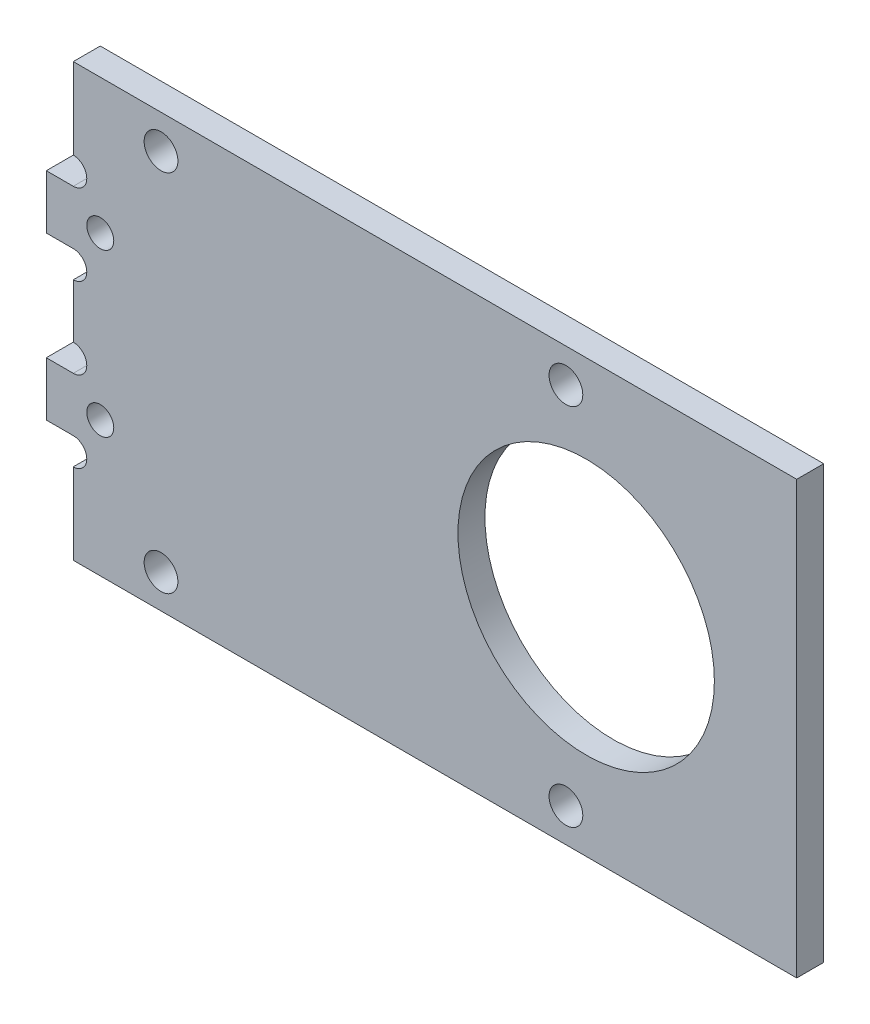
ISO-10303-21;
HEADER;
FILE_DESCRIPTION(('STEP AP214'),'2;1');
FILE_NAME('part.step','',(''),(''),'','','');
FILE_SCHEMA(('AUTOMOTIVE_DESIGN { 1 0 10303 214 1 1 1 1 }'));
ENDSEC;
DATA;
#1=APPLICATION_CONTEXT('core data for automotive mechanical design processes');
#2=APPLICATION_PROTOCOL_DEFINITION('international standard','automotive_design',2000,#1);
#3=PRODUCT_CONTEXT('',#1,'mechanical');
#4=PRODUCT('Part','Part','',(#3));
#5=PRODUCT_RELATED_PRODUCT_CATEGORY('part','',(#4));
#6=PRODUCT_DEFINITION_FORMATION('','',#4);
#7=PRODUCT_DEFINITION_CONTEXT('part definition',#1,'design');
#8=PRODUCT_DEFINITION('design','',#6,#7);
#9=PRODUCT_DEFINITION_SHAPE('','',#8);
#10=(LENGTH_UNIT() NAMED_UNIT(*) SI_UNIT(.MILLI.,.METRE.));
#11=(NAMED_UNIT(*) PLANE_ANGLE_UNIT() SI_UNIT($,.RADIAN.));
#12=(NAMED_UNIT(*) SI_UNIT($,.STERADIAN.) SOLID_ANGLE_UNIT());
#13=UNCERTAINTY_MEASURE_WITH_UNIT(LENGTH_MEASURE(1.E-05),#10,'distance_accuracy_value','');
#14=(GEOMETRIC_REPRESENTATION_CONTEXT(3) GLOBAL_UNCERTAINTY_ASSIGNED_CONTEXT((#13)) GLOBAL_UNIT_ASSIGNED_CONTEXT((#10,
#11,#12)) REPRESENTATION_CONTEXT('',''));
#15=CARTESIAN_POINT('',(0.,0.,0.));
#16=DIRECTION('',(0.,0.,1.));
#17=DIRECTION('',(1.,0.,0.));
#18=AXIS2_PLACEMENT_3D('',#15,#16,#17);
#19=CARTESIAN_POINT('',(-8.86843463568493,-9.10629075351366,2.));
#20=DIRECTION('',(0.,0.,-1.));
#21=DIRECTION('',(-1.,0.,0.));
#22=AXIS2_PLACEMENT_3D('',#19,#20,#21);
#23=PLANE('',#22);
#24=DIRECTION('',(-1.,0.,0.));
#25=VECTOR('',#24,1.);
#26=CARTESIAN_POINT('',(-8.86843463568493,15.8937092464863,2.));
#27=LINE('',#26,#25);
#28=CARTESIAN_POINT('',(44.7315653643151,15.8937092464863,2.));
#29=VERTEX_POINT('',#28);
#30=CARTESIAN_POINT('',(-8.86843463568493,15.8937092464863,2.));
#31=VERTEX_POINT('',#30);
#32=EDGE_CURVE('E208',#29,#31,#27,.T.);
#33=ORIENTED_EDGE('',*,*,#32,.T.);
#34=DIRECTION('',(0.,-1.,0.));
#35=VECTOR('',#34,1.);
#36=CARTESIAN_POINT('',(-8.86843463568494,14.8937092464863,2.));
#37=LINE('',#36,#35);
#38=CARTESIAN_POINT('',(-8.86843463568494,9.89370924648633,2.));
#39=VERTEX_POINT('',#38);
#40=EDGE_CURVE('E112',#31,#39,#37,.T.);
#41=ORIENTED_EDGE('',*,*,#40,.T.);
#42=CARTESIAN_POINT('',(-8.86843463568494,8.89370924648633,2.));
#43=DIRECTION('',(0.,0.,-1.));
#44=DIRECTION('',(1.,0.,0.));
#45=AXIS2_PLACEMENT_3D('',#42,#43,#44);
#46=CIRCLE('',#45,1.);
#47=CARTESIAN_POINT('',(-8.86843463568494,7.89370924648633,2.));
#48=VERTEX_POINT('',#47);
#49=EDGE_CURVE('E248',#39,#48,#46,.T.);
#50=ORIENTED_EDGE('',*,*,#49,.T.);
#51=DIRECTION('',(-1.,0.,0.));
#52=VECTOR('',#51,1.);
#53=CARTESIAN_POINT('',(-8.86843463568494,7.89370924648634,2.));
#54=LINE('',#53,#52);
#55=CARTESIAN_POINT('',(-10.8684346356849,7.89370924648633,2.));
#56=VERTEX_POINT('',#55);
#57=EDGE_CURVE('E265',#48,#56,#54,.T.);
#58=ORIENTED_EDGE('',*,*,#57,.T.);
#59=DIRECTION('',(0.,-1.,0.));
#60=VECTOR('',#59,1.);
#61=CARTESIAN_POINT('',(-10.8684346356849,7.89370924648633,2.));
#62=LINE('',#61,#60);
#63=CARTESIAN_POINT('',(-10.8684346356849,3.89370924648633,2.));
#64=VERTEX_POINT('',#63);
#65=EDGE_CURVE('E262',#56,#64,#62,.T.);
#66=ORIENTED_EDGE('',*,*,#65,.T.);
#67=DIRECTION('',(1.,0.,0.));
#68=VECTOR('',#67,1.);
#69=CARTESIAN_POINT('',(-8.86843463568494,3.89370924648633,2.));
#70=LINE('',#69,#68);
#71=CARTESIAN_POINT('',(-8.86843463568494,3.89370924648633,2.));
#72=VERTEX_POINT('',#71);
#73=EDGE_CURVE('E264',#64,#72,#70,.T.);
#74=ORIENTED_EDGE('',*,*,#73,.T.);
#75=CARTESIAN_POINT('',(-8.86843463568494,2.89370924648633,2.));
#76=DIRECTION('',(0.,0.,-1.));
#77=DIRECTION('',(-1.,0.,0.));
#78=AXIS2_PLACEMENT_3D('',#75,#76,#77);
#79=CIRCLE('',#78,1.);
#80=CARTESIAN_POINT('',(-8.86843463568494,1.89370924648633,2.));
#81=VERTEX_POINT('',#80);
#82=EDGE_CURVE('E267',#72,#81,#79,.T.);
#83=ORIENTED_EDGE('',*,*,#82,.T.);
#84=DIRECTION('',(0.,-1.,0.));
#85=VECTOR('',#84,1.);
#86=CARTESIAN_POINT('',(-8.86843463568494,1.89370924648633,2.));
#87=LINE('',#86,#85);
#88=CARTESIAN_POINT('',(-8.86843463568494,-2.10629075351366,2.));
#89=VERTEX_POINT('',#88);
#90=EDGE_CURVE('E273',#81,#89,#87,.T.);
#91=ORIENTED_EDGE('',*,*,#90,.T.);
#92=CARTESIAN_POINT('',(-8.86843463568494,-3.10629075351366,2.));
#93=DIRECTION('',(0.,0.,-1.));
#94=DIRECTION('',(1.,0.,0.));
#95=AXIS2_PLACEMENT_3D('',#92,#93,#94);
#96=CIRCLE('',#95,1.);
#97=CARTESIAN_POINT('',(-8.86843463568494,-4.10629075351366,2.));
#98=VERTEX_POINT('',#97);
#99=EDGE_CURVE('E275',#89,#98,#96,.T.);
#100=ORIENTED_EDGE('',*,*,#99,.T.);
#101=DIRECTION('',(-1.,0.,0.));
#102=VECTOR('',#101,1.);
#103=CARTESIAN_POINT('',(-8.86843463568494,-4.10629075351366,2.));
#104=LINE('',#103,#102);
#105=CARTESIAN_POINT('',(-10.8684346356849,-4.10629075351366,2.));
#106=VERTEX_POINT('',#105);
#107=EDGE_CURVE('E277',#98,#106,#104,.T.);
#108=ORIENTED_EDGE('',*,*,#107,.T.);
#109=DIRECTION('',(0.,-1.,0.));
#110=VECTOR('',#109,1.);
#111=CARTESIAN_POINT('',(-10.8684346356849,-4.10629075351366,2.));
#112=LINE('',#111,#110);
#113=CARTESIAN_POINT('',(-10.8684346356849,-8.10629075351366,2.));
#114=VERTEX_POINT('',#113);
#115=EDGE_CURVE('E279',#106,#114,#112,.T.);
#116=ORIENTED_EDGE('',*,*,#115,.T.);
#117=DIRECTION('',(1.,0.,0.));
#118=VECTOR('',#117,1.);
#119=CARTESIAN_POINT('',(-8.86843463568493,-8.10629075351366,2.));
#120=LINE('',#119,#118);
#121=CARTESIAN_POINT('',(-8.86843463568493,-8.10629075351366,2.));
#122=VERTEX_POINT('',#121);
#123=EDGE_CURVE('E281',#114,#122,#120,.T.);
#124=ORIENTED_EDGE('',*,*,#123,.T.);
#125=CARTESIAN_POINT('',(-8.86843463568493,-9.10629075351366,2.));
#126=DIRECTION('',(0.,0.,-1.));
#127=DIRECTION('',(-1.,0.,0.));
#128=AXIS2_PLACEMENT_3D('',#125,#126,#127);
#129=CIRCLE('',#128,1.);
#130=CARTESIAN_POINT('',(-8.86843463568493,-10.1062907535137,2.));
#131=VERTEX_POINT('',#130);
#132=EDGE_CURVE('E156',#122,#131,#129,.T.);
#133=ORIENTED_EDGE('',*,*,#132,.T.);
#134=DIRECTION('',(0.,-1.,0.));
#135=VECTOR('',#134,1.);
#136=CARTESIAN_POINT('',(-8.86843463568493,-10.1062907535137,2.));
#137=LINE('',#136,#135);
#138=CARTESIAN_POINT('',(-8.86843463568493,-16.1062907535137,2.));
#139=VERTEX_POINT('',#138);
#140=EDGE_CURVE('E149',#131,#139,#137,.T.);
#141=ORIENTED_EDGE('',*,*,#140,.T.);
#142=DIRECTION('',(1.,0.,0.));
#143=VECTOR('',#142,1.);
#144=CARTESIAN_POINT('',(-8.86843463568493,-16.1062907535137,2.));
#145=LINE('',#144,#143);
#146=CARTESIAN_POINT('',(44.7315653643151,-16.1062907535137,2.));
#147=VERTEX_POINT('',#146);
#148=EDGE_CURVE('E153',#139,#147,#145,.T.);
#149=ORIENTED_EDGE('',*,*,#148,.T.);
#150=DIRECTION('',(0.,1.,0.));
#151=VECTOR('',#150,1.);
#152=CARTESIAN_POINT('',(44.7315653643151,-15.1062907535137,2.));
#153=LINE('',#152,#151);
#154=EDGE_CURVE('E49',#147,#29,#153,.T.);
#155=ORIENTED_EDGE('',*,*,#154,.T.);
#156=EDGE_LOOP('',(#33,#41,#50,#58,#66,#74,#83,#91,#100,#108,#116,#124,#133,#141,#149,#155));
#157=FACE_BOUND('',#156,.T.);
#158=CARTESIAN_POINT('',(-6.86843463568493,5.89370924648634,2.));
#159=DIRECTION('',(0.,0.,1.));
#160=DIRECTION('',(1.,0.,0.));
#161=AXIS2_PLACEMENT_3D('',#158,#159,#160);
#162=CIRCLE('',#161,1.);
#163=CARTESIAN_POINT('',(-5.86843463568493,5.89370924648634,2.));
#164=VERTEX_POINT('',#163);
#165=EDGE_CURVE('E180',#164,#164,#162,.T.);
#166=ORIENTED_EDGE('',*,*,#165,.F.);
#167=EDGE_LOOP('',(#166));
#168=FACE_BOUND('',#167,.T.);
#169=CARTESIAN_POINT('',(29.1315653643151,-0.106290753513656,2.));
#170=DIRECTION('',(0.,0.,1.));
#171=DIRECTION('',(1.,0.,0.));
#172=AXIS2_PLACEMENT_3D('',#169,#170,#171);
#173=CIRCLE('',#172,9.5);
#174=CARTESIAN_POINT('',(38.6315653643151,-0.106290753513656,2.));
#175=VERTEX_POINT('',#174);
#176=EDGE_CURVE('E305',#175,#175,#173,.T.);
#177=ORIENTED_EDGE('',*,*,#176,.F.);
#178=EDGE_LOOP('',(#177));
#179=FACE_BOUND('',#178,.T.);
#180=CARTESIAN_POINT('',(-6.86843463568493,-6.10629075351366,2.));
#181=DIRECTION('',(0.,0.,1.));
#182=DIRECTION('',(1.,0.,0.));
#183=AXIS2_PLACEMENT_3D('',#180,#181,#182);
#184=CIRCLE('',#183,1.);
#185=CARTESIAN_POINT('',(-5.86843463568493,-6.10629075351366,2.));
#186=VERTEX_POINT('',#185);
#187=EDGE_CURVE('E311',#186,#186,#184,.T.);
#188=ORIENTED_EDGE('',*,*,#187,.F.);
#189=EDGE_LOOP('',(#188));
#190=FACE_BOUND('',#189,.T.);
#191=CARTESIAN_POINT('',(-2.36843463568493,-13.6062907535137,2.));
#192=DIRECTION('',(0.,0.,1.));
#193=DIRECTION('',(1.,0.,0.));
#194=AXIS2_PLACEMENT_3D('',#191,#192,#193);
#195=CIRCLE('',#194,1.25);
#196=CARTESIAN_POINT('',(-1.11843463568493,-13.6062907535137,2.));
#197=VERTEX_POINT('',#196);
#198=EDGE_CURVE('E317',#197,#197,#195,.T.);
#199=ORIENTED_EDGE('',*,*,#198,.F.);
#200=EDGE_LOOP('',(#199));
#201=FACE_BOUND('',#200,.T.);
#202=CARTESIAN_POINT('',(27.6315653643151,13.3937092464863,2.));
#203=DIRECTION('',(0.,0.,1.));
#204=DIRECTION('',(1.,0.,0.));
#205=AXIS2_PLACEMENT_3D('',#202,#203,#204);
#206=CIRCLE('',#205,1.25);
#207=CARTESIAN_POINT('',(28.8815653643151,13.3937092464863,2.));
#208=VERTEX_POINT('',#207);
#209=EDGE_CURVE('E323',#208,#208,#206,.T.);
#210=ORIENTED_EDGE('',*,*,#209,.F.);
#211=EDGE_LOOP('',(#210));
#212=FACE_BOUND('',#211,.T.);
#213=CARTESIAN_POINT('',(27.6315653643151,-13.6062907535137,2.));
#214=DIRECTION('',(0.,0.,1.));
#215=DIRECTION('',(1.,0.,0.));
#216=AXIS2_PLACEMENT_3D('',#213,#214,#215);
#217=CIRCLE('',#216,1.25);
#218=CARTESIAN_POINT('',(28.8815653643151,-13.6062907535137,2.));
#219=VERTEX_POINT('',#218);
#220=EDGE_CURVE('E329',#219,#219,#217,.T.);
#221=ORIENTED_EDGE('',*,*,#220,.F.);
#222=EDGE_LOOP('',(#221));
#223=FACE_BOUND('',#222,.T.);
#224=CARTESIAN_POINT('',(-2.36843463568493,13.3937092464863,2.));
#225=DIRECTION('',(0.,0.,1.));
#226=DIRECTION('',(1.,0.,0.));
#227=AXIS2_PLACEMENT_3D('',#224,#225,#226);
#228=CIRCLE('',#227,1.25);
#229=CARTESIAN_POINT('',(-1.11843463568493,13.3937092464863,2.));
#230=VERTEX_POINT('',#229);
#231=EDGE_CURVE('E335',#230,#230,#228,.T.);
#232=ORIENTED_EDGE('',*,*,#231,.F.);
#233=EDGE_LOOP('',(#232));
#234=FACE_BOUND('',#233,.T.);
#235=ADVANCED_FACE('F32',(#157,#168,#179,#190,#201,#212,#223,#234),#23,.F.);
#236=CARTESIAN_POINT('',(-8.86843463568493,-9.10629075351366,0.));
#237=DIRECTION('',(0.,0.,-1.));
#238=DIRECTION('',(-1.,0.,0.));
#239=AXIS2_PLACEMENT_3D('',#236,#237,#238);
#240=PLANE('',#239);
#241=CARTESIAN_POINT('',(27.6315653643151,-13.6062907535137,0.));
#242=DIRECTION('',(0.,0.,1.));
#243=DIRECTION('',(1.,0.,0.));
#244=AXIS2_PLACEMENT_3D('',#241,#242,#243);
#245=CIRCLE('',#244,1.25);
#246=CARTESIAN_POINT('',(28.8815653643151,-13.6062907535137,0.));
#247=VERTEX_POINT('',#246);
#248=EDGE_CURVE('E332',#247,#247,#245,.T.);
#249=ORIENTED_EDGE('',*,*,#248,.T.);
#250=EDGE_LOOP('',(#249));
#251=FACE_BOUND('',#250,.T.);
#252=CARTESIAN_POINT('',(-2.36843463568493,-13.6062907535137,0.));
#253=DIRECTION('',(0.,0.,1.));
#254=DIRECTION('',(1.,0.,0.));
#255=AXIS2_PLACEMENT_3D('',#252,#253,#254);
#256=CIRCLE('',#255,1.25);
#257=CARTESIAN_POINT('',(-1.11843463568493,-13.6062907535137,0.));
#258=VERTEX_POINT('',#257);
#259=EDGE_CURVE('E320',#258,#258,#256,.T.);
#260=ORIENTED_EDGE('',*,*,#259,.T.);
#261=EDGE_LOOP('',(#260));
#262=FACE_BOUND('',#261,.T.);
#263=CARTESIAN_POINT('',(29.1315653643151,-0.106290753513656,0.));
#264=DIRECTION('',(0.,0.,1.));
#265=DIRECTION('',(1.,0.,0.));
#266=AXIS2_PLACEMENT_3D('',#263,#264,#265);
#267=CIRCLE('',#266,9.5);
#268=CARTESIAN_POINT('',(38.6315653643151,-0.106290753513656,0.));
#269=VERTEX_POINT('',#268);
#270=EDGE_CURVE('E308',#269,#269,#267,.T.);
#271=ORIENTED_EDGE('',*,*,#270,.T.);
#272=EDGE_LOOP('',(#271));
#273=FACE_BOUND('',#272,.T.);
#274=DIRECTION('',(0.,-1.,0.));
#275=VECTOR('',#274,1.);
#276=CARTESIAN_POINT('',(-8.86843463568494,14.8937092464863,0.));
#277=LINE('',#276,#275);
#278=CARTESIAN_POINT('',(-8.86843463568493,15.8937092464863,0.));
#279=VERTEX_POINT('',#278);
#280=CARTESIAN_POINT('',(-8.86843463568494,9.89370924648633,0.));
#281=VERTEX_POINT('',#280);
#282=EDGE_CURVE('E177',#279,#281,#277,.T.);
#283=ORIENTED_EDGE('',*,*,#282,.F.);
#284=DIRECTION('',(-1.,0.,0.));
#285=VECTOR('',#284,1.);
#286=CARTESIAN_POINT('',(-7.86843463568494,15.8937092464863,0.));
#287=LINE('',#286,#285);
#288=CARTESIAN_POINT('',(44.7315653643151,15.8937092464863,0.));
#289=VERTEX_POINT('',#288);
#290=EDGE_CURVE('E105',#289,#279,#287,.T.);
#291=ORIENTED_EDGE('',*,*,#290,.F.);
#292=DIRECTION('',(0.,1.,0.));
#293=VECTOR('',#292,1.);
#294=CARTESIAN_POINT('',(44.7315653643151,14.8937092464863,0.));
#295=LINE('',#294,#293);
#296=CARTESIAN_POINT('',(44.7315653643151,-16.1062907535137,0.));
#297=VERTEX_POINT('',#296);
#298=EDGE_CURVE('E101',#297,#289,#295,.T.);
#299=ORIENTED_EDGE('',*,*,#298,.F.);
#300=DIRECTION('',(1.,0.,0.));
#301=VECTOR('',#300,1.);
#302=CARTESIAN_POINT('',(44.7315653643151,-16.1062907535137,0.));
#303=LINE('',#302,#301);
#304=CARTESIAN_POINT('',(-8.86843463568493,-16.1062907535137,0.));
#305=VERTEX_POINT('',#304);
#306=EDGE_CURVE('E204',#305,#297,#303,.T.);
#307=ORIENTED_EDGE('',*,*,#306,.F.);
#308=DIRECTION('',(0.,-1.,0.));
#309=VECTOR('',#308,1.);
#310=CARTESIAN_POINT('',(-8.86843463568493,-15.1062907535137,0.));
#311=LINE('',#310,#309);
#312=CARTESIAN_POINT('',(-8.86843463568493,-10.1062907535137,0.));
#313=VERTEX_POINT('',#312);
#314=EDGE_CURVE('E165',#313,#305,#311,.T.);
#315=ORIENTED_EDGE('',*,*,#314,.F.);
#316=CARTESIAN_POINT('',(-8.86843463568493,-9.10629075351366,0.));
#317=DIRECTION('',(0.,0.,-1.));
#318=DIRECTION('',(-1.,0.,0.));
#319=AXIS2_PLACEMENT_3D('',#316,#317,#318);
#320=CIRCLE('',#319,1.);
#321=CARTESIAN_POINT('',(-8.86843463568493,-8.10629075351366,0.));
#322=VERTEX_POINT('',#321);
#323=EDGE_CURVE('E200',#322,#313,#320,.T.);
#324=ORIENTED_EDGE('',*,*,#323,.F.);
#325=DIRECTION('',(1.,0.,0.));
#326=VECTOR('',#325,1.);
#327=CARTESIAN_POINT('',(-8.86843463568493,-8.10629075351366,0.));
#328=LINE('',#327,#326);
#329=CARTESIAN_POINT('',(-10.8684346356849,-8.10629075351366,0.));
#330=VERTEX_POINT('',#329);
#331=EDGE_CURVE('E198',#330,#322,#328,.T.);
#332=ORIENTED_EDGE('',*,*,#331,.F.);
#333=DIRECTION('',(0.,-1.,0.));
#334=VECTOR('',#333,1.);
#335=CARTESIAN_POINT('',(-10.8684346356849,-4.10629075351366,0.));
#336=LINE('',#335,#334);
#337=CARTESIAN_POINT('',(-10.8684346356849,-4.10629075351366,0.));
#338=VERTEX_POINT('',#337);
#339=EDGE_CURVE('E196',#338,#330,#336,.T.);
#340=ORIENTED_EDGE('',*,*,#339,.F.);
#341=DIRECTION('',(-1.,0.,0.));
#342=VECTOR('',#341,1.);
#343=CARTESIAN_POINT('',(-8.86843463568494,-4.10629075351366,0.));
#344=LINE('',#343,#342);
#345=CARTESIAN_POINT('',(-8.86843463568494,-4.10629075351366,0.));
#346=VERTEX_POINT('',#345);
#347=EDGE_CURVE('E194',#346,#338,#344,.T.);
#348=ORIENTED_EDGE('',*,*,#347,.F.);
#349=CARTESIAN_POINT('',(-8.86843463568494,-3.10629075351366,0.));
#350=DIRECTION('',(0.,0.,-1.));
#351=DIRECTION('',(1.,0.,0.));
#352=AXIS2_PLACEMENT_3D('',#349,#350,#351);
#353=CIRCLE('',#352,1.);
#354=CARTESIAN_POINT('',(-8.86843463568494,-2.10629075351366,0.));
#355=VERTEX_POINT('',#354);
#356=EDGE_CURVE('E192',#355,#346,#353,.T.);
#357=ORIENTED_EDGE('',*,*,#356,.F.);
#358=DIRECTION('',(0.,-1.,0.));
#359=VECTOR('',#358,1.);
#360=CARTESIAN_POINT('',(-8.86843463568494,1.89370924648633,0.));
#361=LINE('',#360,#359);
#362=CARTESIAN_POINT('',(-8.86843463568494,1.89370924648633,0.));
#363=VERTEX_POINT('',#362);
#364=EDGE_CURVE('E190',#363,#355,#361,.T.);
#365=ORIENTED_EDGE('',*,*,#364,.F.);
#366=CARTESIAN_POINT('',(-8.86843463568494,2.89370924648633,0.));
#367=DIRECTION('',(0.,0.,-1.));
#368=DIRECTION('',(-1.,0.,0.));
#369=AXIS2_PLACEMENT_3D('',#366,#367,#368);
#370=CIRCLE('',#369,1.);
#371=CARTESIAN_POINT('',(-8.86843463568494,3.89370924648633,0.));
#372=VERTEX_POINT('',#371);
#373=EDGE_CURVE('E188',#372,#363,#370,.T.);
#374=ORIENTED_EDGE('',*,*,#373,.F.);
#375=DIRECTION('',(1.,0.,0.));
#376=VECTOR('',#375,1.);
#377=CARTESIAN_POINT('',(-8.86843463568494,3.89370924648633,0.));
#378=LINE('',#377,#376);
#379=CARTESIAN_POINT('',(-10.8684346356849,3.89370924648633,0.));
#380=VERTEX_POINT('',#379);
#381=EDGE_CURVE('E186',#380,#372,#378,.T.);
#382=ORIENTED_EDGE('',*,*,#381,.F.);
#383=DIRECTION('',(0.,-1.,0.));
#384=VECTOR('',#383,1.);
#385=CARTESIAN_POINT('',(-10.8684346356849,7.89370924648633,0.));
#386=LINE('',#385,#384);
#387=CARTESIAN_POINT('',(-10.8684346356849,7.89370924648633,0.));
#388=VERTEX_POINT('',#387);
#389=EDGE_CURVE('E184',#388,#380,#386,.T.);
#390=ORIENTED_EDGE('',*,*,#389,.F.);
#391=DIRECTION('',(-1.,0.,0.));
#392=VECTOR('',#391,1.);
#393=CARTESIAN_POINT('',(-8.86843463568494,7.89370924648634,0.));
#394=LINE('',#393,#392);
#395=CARTESIAN_POINT('',(-8.86843463568494,7.89370924648633,0.));
#396=VERTEX_POINT('',#395);
#397=EDGE_CURVE('E182',#396,#388,#394,.T.);
#398=ORIENTED_EDGE('',*,*,#397,.F.);
#399=CARTESIAN_POINT('',(-8.86843463568494,8.89370924648633,0.));
#400=DIRECTION('',(0.,0.,-1.));
#401=DIRECTION('',(1.,0.,0.));
#402=AXIS2_PLACEMENT_3D('',#399,#400,#401);
#403=CIRCLE('',#402,1.);
#404=EDGE_CURVE('E179',#281,#396,#403,.T.);
#405=ORIENTED_EDGE('',*,*,#404,.F.);
#406=EDGE_LOOP('',(#283,#291,#299,#307,#315,#324,#332,#340,#348,#357,#365,#374,#382,#390,#398,#405));
#407=FACE_BOUND('',#406,.T.);
#408=CARTESIAN_POINT('',(-6.86843463568493,5.89370924648634,0.));
#409=DIRECTION('',(0.,0.,1.));
#410=DIRECTION('',(1.,0.,0.));
#411=AXIS2_PLACEMENT_3D('',#408,#409,#410);
#412=CIRCLE('',#411,1.);
#413=CARTESIAN_POINT('',(-5.86843463568493,5.89370924648634,0.));
#414=VERTEX_POINT('',#413);
#415=EDGE_CURVE('E302',#414,#414,#412,.T.);
#416=ORIENTED_EDGE('',*,*,#415,.T.);
#417=EDGE_LOOP('',(#416));
#418=FACE_BOUND('',#417,.T.);
#419=CARTESIAN_POINT('',(-6.86843463568493,-6.10629075351366,0.));
#420=DIRECTION('',(0.,0.,1.));
#421=DIRECTION('',(1.,0.,0.));
#422=AXIS2_PLACEMENT_3D('',#419,#420,#421);
#423=CIRCLE('',#422,1.);
#424=CARTESIAN_POINT('',(-5.86843463568493,-6.10629075351366,0.));
#425=VERTEX_POINT('',#424);
#426=EDGE_CURVE('E314',#425,#425,#423,.T.);
#427=ORIENTED_EDGE('',*,*,#426,.T.);
#428=EDGE_LOOP('',(#427));
#429=FACE_BOUND('',#428,.T.);
#430=CARTESIAN_POINT('',(27.6315653643151,13.3937092464863,0.));
#431=DIRECTION('',(0.,0.,1.));
#432=DIRECTION('',(1.,0.,0.));
#433=AXIS2_PLACEMENT_3D('',#430,#431,#432);
#434=CIRCLE('',#433,1.25);
#435=CARTESIAN_POINT('',(28.8815653643151,13.3937092464863,0.));
#436=VERTEX_POINT('',#435);
#437=EDGE_CURVE('E326',#436,#436,#434,.T.);
#438=ORIENTED_EDGE('',*,*,#437,.T.);
#439=EDGE_LOOP('',(#438));
#440=FACE_BOUND('',#439,.T.);
#441=CARTESIAN_POINT('',(-2.36843463568493,13.3937092464863,0.));
#442=DIRECTION('',(0.,0.,1.));
#443=DIRECTION('',(1.,0.,0.));
#444=AXIS2_PLACEMENT_3D('',#441,#442,#443);
#445=CIRCLE('',#444,1.25);
#446=CARTESIAN_POINT('',(-1.11843463568493,13.3937092464863,0.));
#447=VERTEX_POINT('',#446);
#448=EDGE_CURVE('E338',#447,#447,#445,.T.);
#449=ORIENTED_EDGE('',*,*,#448,.T.);
#450=EDGE_LOOP('',(#449));
#451=FACE_BOUND('',#450,.T.);
#452=ADVANCED_FACE('F250',(#251,#262,#273,#407,#418,#429,#440,#451),#240,.T.);
#453=CARTESIAN_POINT('',(-8.86843463568494,14.8937092464863,2.));
#454=DIRECTION('',(1.,0.,0.));
#455=DIRECTION('',(0.,0.,-1.));
#456=AXIS2_PLACEMENT_3D('',#453,#454,#455);
#457=PLANE('',#456);
#458=ORIENTED_EDGE('',*,*,#282,.T.);
#459=DIRECTION('',(0.,0.,-1.));
#460=VECTOR('',#459,1.);
#461=CARTESIAN_POINT('',(-8.86843463568494,9.89370924648633,2.));
#462=LINE('',#461,#460);
#463=EDGE_CURVE('E41',#39,#281,#462,.T.);
#464=ORIENTED_EDGE('',*,*,#463,.F.);
#465=ORIENTED_EDGE('',*,*,#40,.F.);
#466=DIRECTION('',(0.,0.,-1.));
#467=VECTOR('',#466,1.);
#468=CARTESIAN_POINT('',(-8.86843463568493,15.8937092464863,2.));
#469=LINE('',#468,#467);
#470=EDGE_CURVE('E11',#31,#279,#469,.T.);
#471=ORIENTED_EDGE('',*,*,#470,.T.);
#472=EDGE_LOOP('',(#458,#464,#465,#471));
#473=FACE_BOUND('',#472,.T.);
#474=ADVANCED_FACE('F34',(#473),#457,.F.);
#475=CARTESIAN_POINT('',(-8.86843463568494,8.89370924648633,2.));
#476=DIRECTION('',(0.,0.,-1.));
#477=DIRECTION('',(-1.,0.,0.));
#478=AXIS2_PLACEMENT_3D('',#475,#476,#477);
#479=CYLINDRICAL_SURFACE('',#478,1.);
#480=ORIENTED_EDGE('',*,*,#404,.T.);
#481=DIRECTION('',(0.,0.,-1.));
#482=VECTOR('',#481,1.);
#483=CARTESIAN_POINT('',(-8.86843463568494,7.89370924648633,2.));
#484=LINE('',#483,#482);
#485=EDGE_CURVE('E240',#48,#396,#484,.T.);
#486=ORIENTED_EDGE('',*,*,#485,.F.);
#487=ORIENTED_EDGE('',*,*,#49,.F.);
#488=ORIENTED_EDGE('',*,*,#463,.T.);
#489=EDGE_LOOP('',(#480,#486,#487,#488));
#490=FACE_BOUND('',#489,.T.);
#491=ADVANCED_FACE('F246',(#490),#479,.F.);
#492=CARTESIAN_POINT('',(-8.86843463568494,7.89370924648634,2.));
#493=DIRECTION('',(0.,-1.,0.));
#494=DIRECTION('',(1.,0.,0.));
#495=AXIS2_PLACEMENT_3D('',#492,#493,#494);
#496=PLANE('',#495);
#497=ORIENTED_EDGE('',*,*,#397,.T.);
#498=DIRECTION('',(0.,0.,-1.));
#499=VECTOR('',#498,1.);
#500=CARTESIAN_POINT('',(-10.8684346356849,7.89370924648633,2.));
#501=LINE('',#500,#499);
#502=EDGE_CURVE('E237',#56,#388,#501,.T.);
#503=ORIENTED_EDGE('',*,*,#502,.F.);
#504=ORIENTED_EDGE('',*,*,#57,.F.);
#505=ORIENTED_EDGE('',*,*,#485,.T.);
#506=EDGE_LOOP('',(#497,#503,#504,#505));
#507=FACE_BOUND('',#506,.T.);
#508=ADVANCED_FACE('F256',(#507),#496,.F.);
#509=CARTESIAN_POINT('',(-10.8684346356849,7.89370924648633,2.));
#510=DIRECTION('',(1.,0.,0.));
#511=DIRECTION('',(0.,1.,0.));
#512=AXIS2_PLACEMENT_3D('',#509,#510,#511);
#513=PLANE('',#512);
#514=ORIENTED_EDGE('',*,*,#389,.T.);
#515=DIRECTION('',(0.,0.,-1.));
#516=VECTOR('',#515,1.);
#517=CARTESIAN_POINT('',(-10.8684346356849,3.89370924648633,2.));
#518=LINE('',#517,#516);
#519=EDGE_CURVE('E234',#64,#380,#518,.T.);
#520=ORIENTED_EDGE('',*,*,#519,.F.);
#521=ORIENTED_EDGE('',*,*,#65,.F.);
#522=ORIENTED_EDGE('',*,*,#502,.T.);
#523=EDGE_LOOP('',(#514,#520,#521,#522));
#524=FACE_BOUND('',#523,.T.);
#525=ADVANCED_FACE('F260',(#524),#513,.F.);
#526=CARTESIAN_POINT('',(-8.86843463568494,3.89370924648633,2.));
#527=DIRECTION('',(0.,1.,0.));
#528=DIRECTION('',(-1.,0.,0.));
#529=AXIS2_PLACEMENT_3D('',#526,#527,#528);
#530=PLANE('',#529);
#531=ORIENTED_EDGE('',*,*,#381,.T.);
#532=DIRECTION('',(0.,0.,-1.));
#533=VECTOR('',#532,1.);
#534=CARTESIAN_POINT('',(-8.86843463568494,3.89370924648633,2.));
#535=LINE('',#534,#533);
#536=EDGE_CURVE('E231',#72,#372,#535,.T.);
#537=ORIENTED_EDGE('',*,*,#536,.F.);
#538=ORIENTED_EDGE('',*,*,#73,.F.);
#539=ORIENTED_EDGE('',*,*,#519,.T.);
#540=EDGE_LOOP('',(#531,#537,#538,#539));
#541=FACE_BOUND('',#540,.T.);
#542=ADVANCED_FACE('F389',(#541),#530,.F.);
#543=CARTESIAN_POINT('',(-8.86843463568494,2.89370924648633,2.));
#544=DIRECTION('',(0.,0.,-1.));
#545=DIRECTION('',(-1.,0.,0.));
#546=AXIS2_PLACEMENT_3D('',#543,#544,#545);
#547=CYLINDRICAL_SURFACE('',#546,1.);
#548=ORIENTED_EDGE('',*,*,#373,.T.);
#549=DIRECTION('',(0.,0.,-1.));
#550=VECTOR('',#549,1.);
#551=CARTESIAN_POINT('',(-8.86843463568494,1.89370924648633,2.));
#552=LINE('',#551,#550);
#553=EDGE_CURVE('E228',#81,#363,#552,.T.);
#554=ORIENTED_EDGE('',*,*,#553,.F.);
#555=ORIENTED_EDGE('',*,*,#82,.F.);
#556=ORIENTED_EDGE('',*,*,#536,.T.);
#557=EDGE_LOOP('',(#548,#554,#555,#556));
#558=FACE_BOUND('',#557,.T.);
#559=ADVANCED_FACE('F385',(#558),#547,.F.);
#560=CARTESIAN_POINT('',(-8.86843463568494,1.89370924648633,2.));
#561=DIRECTION('',(1.,0.,0.));
#562=DIRECTION('',(0.,1.,0.));
#563=AXIS2_PLACEMENT_3D('',#560,#561,#562);
#564=PLANE('',#563);
#565=ORIENTED_EDGE('',*,*,#364,.T.);
#566=DIRECTION('',(0.,0.,-1.));
#567=VECTOR('',#566,1.);
#568=CARTESIAN_POINT('',(-8.86843463568494,-2.10629075351366,2.));
#569=LINE('',#568,#567);
#570=EDGE_CURVE('E225',#89,#355,#569,.T.);
#571=ORIENTED_EDGE('',*,*,#570,.F.);
#572=ORIENTED_EDGE('',*,*,#90,.F.);
#573=ORIENTED_EDGE('',*,*,#553,.T.);
#574=EDGE_LOOP('',(#565,#571,#572,#573));
#575=FACE_BOUND('',#574,.T.);
#576=ADVANCED_FACE('F381',(#575),#564,.F.);
#577=CARTESIAN_POINT('',(-8.86843463568494,-3.10629075351366,2.));
#578=DIRECTION('',(0.,0.,-1.));
#579=DIRECTION('',(-1.,0.,0.));
#580=AXIS2_PLACEMENT_3D('',#577,#578,#579);
#581=CYLINDRICAL_SURFACE('',#580,1.);
#582=ORIENTED_EDGE('',*,*,#356,.T.);
#583=DIRECTION('',(0.,0.,-1.));
#584=VECTOR('',#583,1.);
#585=CARTESIAN_POINT('',(-8.86843463568494,-4.10629075351366,2.));
#586=LINE('',#585,#584);
#587=EDGE_CURVE('E222',#98,#346,#586,.T.);
#588=ORIENTED_EDGE('',*,*,#587,.F.);
#589=ORIENTED_EDGE('',*,*,#99,.F.);
#590=ORIENTED_EDGE('',*,*,#570,.T.);
#591=EDGE_LOOP('',(#582,#588,#589,#590));
#592=FACE_BOUND('',#591,.T.);
#593=ADVANCED_FACE('F377',(#592),#581,.F.);
#594=CARTESIAN_POINT('',(-8.86843463568494,-4.10629075351366,2.));
#595=DIRECTION('',(0.,-1.,0.));
#596=DIRECTION('',(0.,0.,-1.));
#597=AXIS2_PLACEMENT_3D('',#594,#595,#596);
#598=PLANE('',#597);
#599=ORIENTED_EDGE('',*,*,#347,.T.);
#600=DIRECTION('',(0.,0.,-1.));
#601=VECTOR('',#600,1.);
#602=CARTESIAN_POINT('',(-10.8684346356849,-4.10629075351366,2.));
#603=LINE('',#602,#601);
#604=EDGE_CURVE('E219',#106,#338,#603,.T.);
#605=ORIENTED_EDGE('',*,*,#604,.F.);
#606=ORIENTED_EDGE('',*,*,#107,.F.);
#607=ORIENTED_EDGE('',*,*,#587,.T.);
#608=EDGE_LOOP('',(#599,#605,#606,#607));
#609=FACE_BOUND('',#608,.T.);
#610=ADVANCED_FACE('F373',(#609),#598,.F.);
#611=CARTESIAN_POINT('',(-10.8684346356849,-4.10629075351366,2.));
#612=DIRECTION('',(1.,0.,0.));
#613=DIRECTION('',(0.,0.,-1.));
#614=AXIS2_PLACEMENT_3D('',#611,#612,#613);
#615=PLANE('',#614);
#616=ORIENTED_EDGE('',*,*,#339,.T.);
#617=DIRECTION('',(0.,0.,-1.));
#618=VECTOR('',#617,1.);
#619=CARTESIAN_POINT('',(-10.8684346356849,-8.10629075351366,2.));
#620=LINE('',#619,#618);
#621=EDGE_CURVE('E216',#114,#330,#620,.T.);
#622=ORIENTED_EDGE('',*,*,#621,.F.);
#623=ORIENTED_EDGE('',*,*,#115,.F.);
#624=ORIENTED_EDGE('',*,*,#604,.T.);
#625=EDGE_LOOP('',(#616,#622,#623,#624));
#626=FACE_BOUND('',#625,.T.);
#627=ADVANCED_FACE('F370',(#626),#615,.F.);
#628=CARTESIAN_POINT('',(-8.86843463568493,-8.10629075351366,2.));
#629=DIRECTION('',(0.,1.,0.));
#630=DIRECTION('',(0.,0.,1.));
#631=AXIS2_PLACEMENT_3D('',#628,#629,#630);
#632=PLANE('',#631);
#633=ORIENTED_EDGE('',*,*,#331,.T.);
#634=DIRECTION('',(0.,0.,-1.));
#635=VECTOR('',#634,1.);
#636=CARTESIAN_POINT('',(-8.86843463568493,-8.10629075351366,2.));
#637=LINE('',#636,#635);
#638=EDGE_CURVE('E213',#122,#322,#637,.T.);
#639=ORIENTED_EDGE('',*,*,#638,.F.);
#640=ORIENTED_EDGE('',*,*,#123,.F.);
#641=ORIENTED_EDGE('',*,*,#621,.T.);
#642=EDGE_LOOP('',(#633,#639,#640,#641));
#643=FACE_BOUND('',#642,.T.);
#644=ADVANCED_FACE('F287',(#643),#632,.F.);
#645=CARTESIAN_POINT('',(-8.86843463568493,-9.10629075351366,2.));
#646=DIRECTION('',(0.,0.,-1.));
#647=DIRECTION('',(-1.,0.,0.));
#648=AXIS2_PLACEMENT_3D('',#645,#646,#647);
#649=CYLINDRICAL_SURFACE('',#648,1.);
#650=ORIENTED_EDGE('',*,*,#323,.T.);
#651=DIRECTION('',(0.,0.,-1.));
#652=VECTOR('',#651,1.);
#653=CARTESIAN_POINT('',(-8.86843463568493,-10.1062907535137,2.));
#654=LINE('',#653,#652);
#655=EDGE_CURVE('E167',#131,#313,#654,.T.);
#656=ORIENTED_EDGE('',*,*,#655,.F.);
#657=ORIENTED_EDGE('',*,*,#132,.F.);
#658=ORIENTED_EDGE('',*,*,#638,.T.);
#659=EDGE_LOOP('',(#650,#656,#657,#658));
#660=FACE_BOUND('',#659,.T.);
#661=ADVANCED_FACE('F291',(#660),#649,.F.);
#662=CARTESIAN_POINT('',(-8.86843463568493,-15.1062907535137,2.));
#663=DIRECTION('',(1.,0.,0.));
#664=DIRECTION('',(0.,1.,0.));
#665=AXIS2_PLACEMENT_3D('',#662,#663,#664);
#666=PLANE('',#665);
#667=ORIENTED_EDGE('',*,*,#314,.T.);
#668=DIRECTION('',(0.,0.,-1.));
#669=VECTOR('',#668,1.);
#670=CARTESIAN_POINT('',(-8.86843463568493,-16.1062907535137,2.));
#671=LINE('',#670,#669);
#672=EDGE_CURVE('E163',#139,#305,#671,.T.);
#673=ORIENTED_EDGE('',*,*,#672,.F.);
#674=ORIENTED_EDGE('',*,*,#140,.F.);
#675=ORIENTED_EDGE('',*,*,#655,.T.);
#676=EDGE_LOOP('',(#667,#673,#674,#675));
#677=FACE_BOUND('',#676,.T.);
#678=ADVANCED_FACE('F164',(#677),#666,.F.);
#679=CARTESIAN_POINT('',(44.7315653643151,-16.1062907535137,2.));
#680=DIRECTION('',(0.,1.,0.));
#681=DIRECTION('',(-1.,0.,0.));
#682=AXIS2_PLACEMENT_3D('',#679,#680,#681);
#683=PLANE('',#682);
#684=ORIENTED_EDGE('',*,*,#306,.T.);
#685=DIRECTION('',(0.,0.,-1.));
#686=VECTOR('',#685,1.);
#687=CARTESIAN_POINT('',(44.7315653643151,-16.1062907535137,2.));
#688=LINE('',#687,#686);
#689=EDGE_CURVE('E168',#147,#297,#688,.T.);
#690=ORIENTED_EDGE('',*,*,#689,.F.);
#691=ORIENTED_EDGE('',*,*,#148,.F.);
#692=ORIENTED_EDGE('',*,*,#672,.T.);
#693=EDGE_LOOP('',(#684,#690,#691,#692));
#694=FACE_BOUND('',#693,.T.);
#695=ADVANCED_FACE('F170',(#694),#683,.F.);
#696=CARTESIAN_POINT('',(44.7315653643151,14.8937092464863,2.));
#697=DIRECTION('',(-1.,0.,0.));
#698=DIRECTION('',(0.,0.,1.));
#699=AXIS2_PLACEMENT_3D('',#696,#697,#698);
#700=PLANE('',#699);
#701=ORIENTED_EDGE('',*,*,#298,.T.);
#702=DIRECTION('',(0.,0.,-1.));
#703=VECTOR('',#702,1.);
#704=CARTESIAN_POINT('',(44.7315653643151,15.8937092464863,2.));
#705=LINE('',#704,#703);
#706=EDGE_CURVE('E173',#29,#289,#705,.T.);
#707=ORIENTED_EDGE('',*,*,#706,.F.);
#708=ORIENTED_EDGE('',*,*,#154,.F.);
#709=ORIENTED_EDGE('',*,*,#689,.T.);
#710=EDGE_LOOP('',(#701,#707,#708,#709));
#711=FACE_BOUND('',#710,.T.);
#712=ADVANCED_FACE('F294',(#711),#700,.F.);
#713=CARTESIAN_POINT('',(-7.86843463568494,15.8937092464863,2.));
#714=DIRECTION('',(0.,-1.,0.));
#715=DIRECTION('',(1.,0.,0.));
#716=AXIS2_PLACEMENT_3D('',#713,#714,#715);
#717=PLANE('',#716);
#718=ORIENTED_EDGE('',*,*,#290,.T.);
#719=ORIENTED_EDGE('',*,*,#470,.F.);
#720=ORIENTED_EDGE('',*,*,#32,.F.);
#721=ORIENTED_EDGE('',*,*,#706,.T.);
#722=EDGE_LOOP('',(#718,#719,#720,#721));
#723=FACE_BOUND('',#722,.T.);
#724=ADVANCED_FACE('F297',(#723),#717,.F.);
#725=CARTESIAN_POINT('',(-6.86843463568493,5.89370924648634,2.));
#726=DIRECTION('',(0.,0.,-1.));
#727=DIRECTION('',(-1.,0.,0.));
#728=AXIS2_PLACEMENT_3D('',#725,#726,#727);
#729=CYLINDRICAL_SURFACE('',#728,1.);
#730=ORIENTED_EDGE('',*,*,#165,.T.);
#731=EDGE_LOOP('',(#730));
#732=FACE_BOUND('',#731,.T.);
#733=ORIENTED_EDGE('',*,*,#415,.F.);
#734=EDGE_LOOP('',(#733));
#735=FACE_BOUND('',#734,.T.);
#736=ADVANCED_FACE('F355',(#732,#735),#729,.F.);
#737=CARTESIAN_POINT('',(29.1315653643151,-0.106290753513656,2.));
#738=DIRECTION('',(0.,0.,-1.));
#739=DIRECTION('',(-1.,0.,0.));
#740=AXIS2_PLACEMENT_3D('',#737,#738,#739);
#741=CYLINDRICAL_SURFACE('',#740,9.5);
#742=ORIENTED_EDGE('',*,*,#176,.T.);
#743=EDGE_LOOP('',(#742));
#744=FACE_BOUND('',#743,.T.);
#745=ORIENTED_EDGE('',*,*,#270,.F.);
#746=EDGE_LOOP('',(#745));
#747=FACE_BOUND('',#746,.T.);
#748=ADVANCED_FACE('F521',(#744,#747),#741,.F.);
#749=CARTESIAN_POINT('',(-6.86843463568493,-6.10629075351366,2.));
#750=DIRECTION('',(0.,0.,-1.));
#751=DIRECTION('',(-1.,0.,0.));
#752=AXIS2_PLACEMENT_3D('',#749,#750,#751);
#753=CYLINDRICAL_SURFACE('',#752,1.);
#754=ORIENTED_EDGE('',*,*,#187,.T.);
#755=EDGE_LOOP('',(#754));
#756=FACE_BOUND('',#755,.T.);
#757=ORIENTED_EDGE('',*,*,#426,.F.);
#758=EDGE_LOOP('',(#757));
#759=FACE_BOUND('',#758,.T.);
#760=ADVANCED_FACE('F529',(#756,#759),#753,.F.);
#761=CARTESIAN_POINT('',(-2.36843463568493,-13.6062907535137,2.));
#762=DIRECTION('',(0.,0.,-1.));
#763=DIRECTION('',(-1.,0.,0.));
#764=AXIS2_PLACEMENT_3D('',#761,#762,#763);
#765=CYLINDRICAL_SURFACE('',#764,1.25);
#766=ORIENTED_EDGE('',*,*,#198,.T.);
#767=EDGE_LOOP('',(#766));
#768=FACE_BOUND('',#767,.T.);
#769=ORIENTED_EDGE('',*,*,#259,.F.);
#770=EDGE_LOOP('',(#769));
#771=FACE_BOUND('',#770,.T.);
#772=ADVANCED_FACE('F537',(#768,#771),#765,.F.);
#773=CARTESIAN_POINT('',(27.6315653643151,13.3937092464863,2.));
#774=DIRECTION('',(0.,0.,-1.));
#775=DIRECTION('',(-1.,0.,0.));
#776=AXIS2_PLACEMENT_3D('',#773,#774,#775);
#777=CYLINDRICAL_SURFACE('',#776,1.25);
#778=ORIENTED_EDGE('',*,*,#209,.T.);
#779=EDGE_LOOP('',(#778));
#780=FACE_BOUND('',#779,.T.);
#781=ORIENTED_EDGE('',*,*,#437,.F.);
#782=EDGE_LOOP('',(#781));
#783=FACE_BOUND('',#782,.T.);
#784=ADVANCED_FACE('F546',(#780,#783),#777,.F.);
#785=CARTESIAN_POINT('',(27.6315653643151,-13.6062907535137,2.));
#786=DIRECTION('',(0.,0.,-1.));
#787=DIRECTION('',(-1.,0.,0.));
#788=AXIS2_PLACEMENT_3D('',#785,#786,#787);
#789=CYLINDRICAL_SURFACE('',#788,1.25);
#790=ORIENTED_EDGE('',*,*,#220,.T.);
#791=EDGE_LOOP('',(#790));
#792=FACE_BOUND('',#791,.T.);
#793=ORIENTED_EDGE('',*,*,#248,.F.);
#794=EDGE_LOOP('',(#793));
#795=FACE_BOUND('',#794,.T.);
#796=ADVANCED_FACE('F555',(#792,#795),#789,.F.);
#797=CARTESIAN_POINT('',(-2.36843463568493,13.3937092464863,2.));
#798=DIRECTION('',(0.,0.,-1.));
#799=DIRECTION('',(-1.,0.,0.));
#800=AXIS2_PLACEMENT_3D('',#797,#798,#799);
#801=CYLINDRICAL_SURFACE('',#800,1.25);
#802=ORIENTED_EDGE('',*,*,#231,.T.);
#803=EDGE_LOOP('',(#802));
#804=FACE_BOUND('',#803,.T.);
#805=ORIENTED_EDGE('',*,*,#448,.F.);
#806=EDGE_LOOP('',(#805));
#807=FACE_BOUND('',#806,.T.);
#808=ADVANCED_FACE('F344',(#804,#807),#801,.F.);
#809=CLOSED_SHELL('',(#235,#452,#474,#491,#508,#525,#542,#559,#576,#593,#610,#627,#644,#661,
#678,#695,#712,#724,#736,#748,#760,#772,#784,#796,#808));
#810=MANIFOLD_SOLID_BREP('B2',#809);
#811=ADVANCED_BREP_SHAPE_REPRESENTATION('',(#18,#810),#14);
#812=SHAPE_DEFINITION_REPRESENTATION(#9,#811);
ENDSEC;
END-ISO-10303-21;
